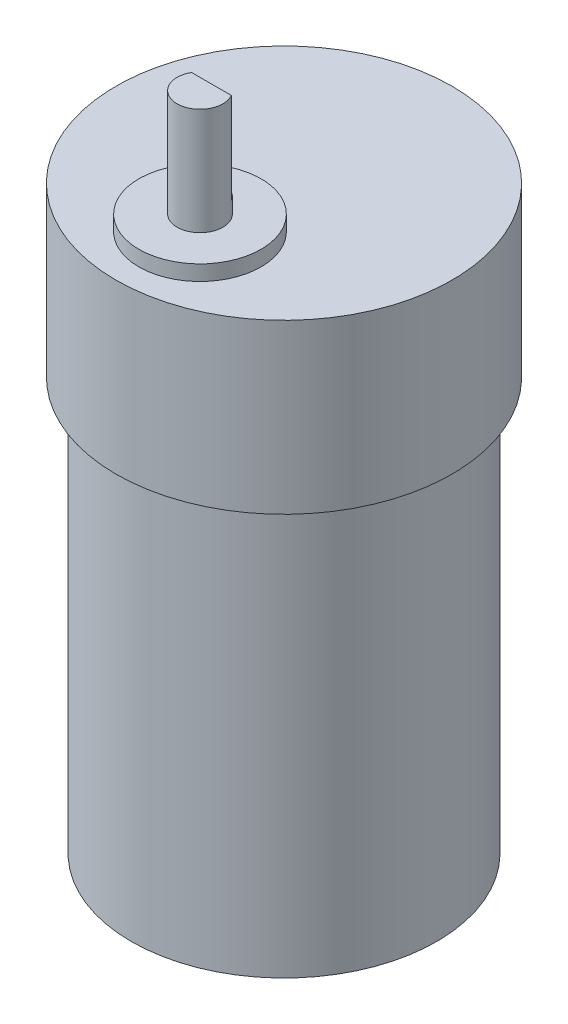
ISO-10303-21;
HEADER;
FILE_DESCRIPTION(('STEP AP214'),'2;1');
FILE_NAME('part.step','',(''),(''),'','','');
FILE_SCHEMA(('AUTOMOTIVE_DESIGN { 1 0 10303 214 1 1 1 1 }'));
ENDSEC;
DATA;
#1=APPLICATION_CONTEXT('core data for automotive mechanical design processes');
#2=APPLICATION_PROTOCOL_DEFINITION('international standard','automotive_design',2000,#1);
#3=PRODUCT_CONTEXT('',#1,'mechanical');
#4=PRODUCT('Part','Part','',(#3));
#5=PRODUCT_RELATED_PRODUCT_CATEGORY('part','',(#4));
#6=PRODUCT_DEFINITION_FORMATION('','',#4);
#7=PRODUCT_DEFINITION_CONTEXT('part definition',#1,'design');
#8=PRODUCT_DEFINITION('design','',#6,#7);
#9=PRODUCT_DEFINITION_SHAPE('','',#8);
#10=(LENGTH_UNIT() NAMED_UNIT(*) SI_UNIT(.MILLI.,.METRE.));
#11=(NAMED_UNIT(*) PLANE_ANGLE_UNIT() SI_UNIT($,.RADIAN.));
#12=(NAMED_UNIT(*) SI_UNIT($,.STERADIAN.) SOLID_ANGLE_UNIT());
#13=UNCERTAINTY_MEASURE_WITH_UNIT(LENGTH_MEASURE(1.E-05),#10,'distance_accuracy_value','');
#14=(GEOMETRIC_REPRESENTATION_CONTEXT(3) GLOBAL_UNCERTAINTY_ASSIGNED_CONTEXT((#13)) GLOBAL_UNIT_ASSIGNED_CONTEXT((#10,
#11,#12)) REPRESENTATION_CONTEXT('',''));
#15=CARTESIAN_POINT('',(0.,0.,0.));
#16=DIRECTION('',(0.,0.,1.));
#17=DIRECTION('',(1.,0.,0.));
#18=AXIS2_PLACEMENT_3D('',#15,#16,#17);
#19=CARTESIAN_POINT('',(0.,0.,0.));
#20=DIRECTION('',(0.,1.,0.));
#21=DIRECTION('',(0.,0.,1.));
#22=AXIS2_PLACEMENT_3D('',#19,#20,#21);
#23=PLANE('',#22);
#24=CARTESIAN_POINT('',(0.,0.,0.));
#25=DIRECTION('',(0.,1.,0.));
#26=DIRECTION('',(0.,0.,1.));
#27=AXIS2_PLACEMENT_3D('',#24,#25,#26);
#28=CIRCLE('',#27,15.875);
#29=CARTESIAN_POINT('',(0.,0.,15.875));
#30=VERTEX_POINT('',#29);
#31=EDGE_CURVE('E92',#30,#30,#28,.T.);
#32=ORIENTED_EDGE('',*,*,#31,.F.);
#33=EDGE_LOOP('',(#32));
#34=FACE_BOUND('',#33,.T.);
#35=CARTESIAN_POINT('',(0.,0.,0.));
#36=DIRECTION('',(0.,1.,0.));
#37=DIRECTION('',(0.,0.,1.));
#38=AXIS2_PLACEMENT_3D('',#35,#36,#37);
#39=CIRCLE('',#38,4.7625);
#40=CARTESIAN_POINT('',(0.,0.,4.7625));
#41=VERTEX_POINT('',#40);
#42=EDGE_CURVE('E11',#41,#41,#39,.F.);
#43=ORIENTED_EDGE('',*,*,#42,.F.);
#44=EDGE_LOOP('',(#43));
#45=FACE_BOUND('',#44,.T.);
#46=ADVANCED_FACE('F35',(#34,#45),#23,.F.);
#47=CARTESIAN_POINT('',(0.,61.9125,8.73252));
#48=DIRECTION('',(0.,1.,0.));
#49=DIRECTION('',(0.,0.,1.));
#50=AXIS2_PLACEMENT_3D('',#47,#48,#49);
#51=PLANE('',#50);
#52=CARTESIAN_POINT('',(0.,61.9125,8.73252));
#53=DIRECTION('',(0.,1.,0.));
#54=DIRECTION('',(0.,0.,1.));
#55=AXIS2_PLACEMENT_3D('',#52,#53,#54);
#56=CIRCLE('',#55,6.35);
#57=CARTESIAN_POINT('',(0.,61.9125,15.08252));
#58=VERTEX_POINT('',#57);
#59=EDGE_CURVE('E80',#58,#58,#56,.T.);
#60=ORIENTED_EDGE('',*,*,#59,.T.);
#61=EDGE_LOOP('',(#60));
#62=FACE_BOUND('',#61,.T.);
#63=CARTESIAN_POINT('',(0.,61.9125,8.73252));
#64=DIRECTION('',(0.,1.,0.));
#65=DIRECTION('',(0.,0.,1.));
#66=AXIS2_PLACEMENT_3D('',#63,#64,#65);
#67=CIRCLE('',#66,2.38125);
#68=CARTESIAN_POINT('',(0.,61.9125,11.11377));
#69=VERTEX_POINT('',#68);
#70=EDGE_CURVE('E74',#69,#69,#67,.T.);
#71=ORIENTED_EDGE('',*,*,#70,.F.);
#72=EDGE_LOOP('',(#71));
#73=FACE_BOUND('',#72,.T.);
#74=ADVANCED_FACE('F102',(#62,#73),#51,.T.);
#75=CARTESIAN_POINT('',(0.,60.325,0.));
#76=DIRECTION('',(0.,1.,0.));
#77=DIRECTION('',(0.,0.,1.));
#78=AXIS2_PLACEMENT_3D('',#75,#76,#77);
#79=PLANE('',#78);
#80=CARTESIAN_POINT('',(0.,60.325,0.));
#81=DIRECTION('',(0.,1.,0.));
#82=DIRECTION('',(0.,0.,1.));
#83=AXIS2_PLACEMENT_3D('',#80,#81,#82);
#84=CIRCLE('',#83,17.4625);
#85=CARTESIAN_POINT('',(0.,60.325,17.4625));
#86=VERTEX_POINT('',#85);
#87=EDGE_CURVE('E89',#86,#86,#84,.T.);
#88=ORIENTED_EDGE('',*,*,#87,.T.);
#89=EDGE_LOOP('',(#88));
#90=FACE_BOUND('',#89,.T.);
#91=CARTESIAN_POINT('',(0.,60.325,8.73252));
#92=DIRECTION('',(0.,1.,0.));
#93=DIRECTION('',(0.,0.,1.));
#94=AXIS2_PLACEMENT_3D('',#91,#92,#93);
#95=CIRCLE('',#94,6.35);
#96=CARTESIAN_POINT('',(0.,60.325,15.08252));
#97=VERTEX_POINT('',#96);
#98=EDGE_CURVE('E77',#97,#97,#95,.T.);
#99=ORIENTED_EDGE('',*,*,#98,.F.);
#100=EDGE_LOOP('',(#99));
#101=FACE_BOUND('',#100,.T.);
#102=ADVANCED_FACE('F130',(#90,#101),#79,.T.);
#103=CARTESIAN_POINT('',(0.,42.8625,0.));
#104=DIRECTION('',(0.,-1.,0.));
#105=DIRECTION('',(0.,0.,-1.));
#106=AXIS2_PLACEMENT_3D('',#103,#104,#105);
#107=CYLINDRICAL_SURFACE('',#106,15.875);
#108=CARTESIAN_POINT('',(0.,42.8625,0.));
#109=DIRECTION('',(0.,1.,0.));
#110=DIRECTION('',(0.,0.,1.));
#111=AXIS2_PLACEMENT_3D('',#108,#109,#110);
#112=CIRCLE('',#111,15.875);
#113=CARTESIAN_POINT('',(0.,42.8625,15.875));
#114=VERTEX_POINT('',#113);
#115=EDGE_CURVE('E43',#114,#114,#112,.T.);
#116=ORIENTED_EDGE('',*,*,#115,.F.);
#117=EDGE_LOOP('',(#116));
#118=FACE_BOUND('',#117,.T.);
#119=ORIENTED_EDGE('',*,*,#31,.T.);
#120=EDGE_LOOP('',(#119));
#121=FACE_BOUND('',#120,.T.);
#122=ADVANCED_FACE('F37',(#118,#121),#107,.T.);
#123=CARTESIAN_POINT('',(0.,42.8625,0.));
#124=DIRECTION('',(0.,1.,0.));
#125=DIRECTION('',(0.,0.,1.));
#126=AXIS2_PLACEMENT_3D('',#123,#124,#125);
#127=PLANE('',#126);
#128=CARTESIAN_POINT('',(0.,42.8625,0.));
#129=DIRECTION('',(0.,1.,0.));
#130=DIRECTION('',(0.,0.,1.));
#131=AXIS2_PLACEMENT_3D('',#128,#129,#130);
#132=CIRCLE('',#131,17.4625);
#133=CARTESIAN_POINT('',(0.,42.8625,17.4625));
#134=VERTEX_POINT('',#133);
#135=EDGE_CURVE('E87',#134,#134,#132,.T.);
#136=ORIENTED_EDGE('',*,*,#135,.F.);
#137=EDGE_LOOP('',(#136));
#138=FACE_BOUND('',#137,.T.);
#139=ORIENTED_EDGE('',*,*,#115,.T.);
#140=EDGE_LOOP('',(#139));
#141=FACE_BOUND('',#140,.T.);
#142=ADVANCED_FACE('F139',(#138,#141),#127,.F.);
#143=CARTESIAN_POINT('',(0.,60.325,0.));
#144=DIRECTION('',(0.,-1.,0.));
#145=DIRECTION('',(0.,0.,-1.));
#146=AXIS2_PLACEMENT_3D('',#143,#144,#145);
#147=CYLINDRICAL_SURFACE('',#146,17.4625);
#148=ORIENTED_EDGE('',*,*,#87,.F.);
#149=EDGE_LOOP('',(#148));
#150=FACE_BOUND('',#149,.T.);
#151=ORIENTED_EDGE('',*,*,#135,.T.);
#152=EDGE_LOOP('',(#151));
#153=FACE_BOUND('',#152,.T.);
#154=ADVANCED_FACE('F134',(#150,#153),#147,.T.);
#155=CARTESIAN_POINT('',(0.,61.9125,8.73252));
#156=DIRECTION('',(0.,-1.,0.));
#157=DIRECTION('',(0.,0.,-1.));
#158=AXIS2_PLACEMENT_3D('',#155,#156,#157);
#159=CYLINDRICAL_SURFACE('',#158,6.35);
#160=ORIENTED_EDGE('',*,*,#59,.F.);
#161=EDGE_LOOP('',(#160));
#162=FACE_BOUND('',#161,.T.);
#163=ORIENTED_EDGE('',*,*,#98,.T.);
#164=EDGE_LOOP('',(#163));
#165=FACE_BOUND('',#164,.T.);
#166=ADVANCED_FACE('F127',(#162,#165),#159,.T.);
#167=CARTESIAN_POINT('',(0.,73.025,8.73252));
#168=DIRECTION('',(0.,-1.,0.));
#169=DIRECTION('',(0.,0.,-1.));
#170=AXIS2_PLACEMENT_3D('',#167,#168,#169);
#171=CYLINDRICAL_SURFACE('',#170,2.38125);
#172=CARTESIAN_POINT('',(0.,73.025,8.73252));
#173=DIRECTION('',(0.,1.,0.));
#174=DIRECTION('',(0.,0.,1.));
#175=AXIS2_PLACEMENT_3D('',#172,#173,#174);
#176=CIRCLE('',#175,2.38125);
#177=CARTESIAN_POINT('',(-2.06222299276169,73.025,7.541895));
#178=VERTEX_POINT('',#177);
#179=CARTESIAN_POINT('',(2.06222299276169,73.025,7.541895));
#180=VERTEX_POINT('',#179);
#181=EDGE_CURVE('E73',#178,#180,#176,.T.);
#182=ORIENTED_EDGE('',*,*,#181,.F.);
#183=DIRECTION('',(0.,1.,0.));
#184=VECTOR('',#183,1.);
#185=CARTESIAN_POINT('',(-2.06222299276169,63.5,7.541895));
#186=LINE('',#185,#184);
#187=CARTESIAN_POINT('',(-2.06222299276169,63.5,7.541895));
#188=VERTEX_POINT('',#187);
#189=EDGE_CURVE('E50',#188,#178,#186,.T.);
#190=ORIENTED_EDGE('',*,*,#189,.F.);
#191=CARTESIAN_POINT('',(0.,63.5,8.73252));
#192=DIRECTION('',(0.,1.,0.));
#193=DIRECTION('',(0.,0.,1.));
#194=AXIS2_PLACEMENT_3D('',#191,#192,#193);
#195=CIRCLE('',#194,2.38125);
#196=CARTESIAN_POINT('',(2.06222299276169,63.5,7.541895));
#197=VERTEX_POINT('',#196);
#198=EDGE_CURVE('E66',#197,#188,#195,.T.);
#199=ORIENTED_EDGE('',*,*,#198,.F.);
#200=DIRECTION('',(0.,1.,0.));
#201=VECTOR('',#200,1.);
#202=CARTESIAN_POINT('',(2.06222299276169,63.5,7.541895));
#203=LINE('',#202,#201);
#204=EDGE_CURVE('E56',#197,#180,#203,.T.);
#205=ORIENTED_EDGE('',*,*,#204,.T.);
#206=EDGE_LOOP('',(#182,#190,#199,#205));
#207=FACE_BOUND('',#206,.T.);
#208=ORIENTED_EDGE('',*,*,#70,.T.);
#209=EDGE_LOOP('',(#208));
#210=FACE_BOUND('',#209,.T.);
#211=ADVANCED_FACE('F71',(#207,#210),#171,.T.);
#212=CARTESIAN_POINT('',(0.,73.025,8.73252));
#213=DIRECTION('',(0.,1.,0.));
#214=DIRECTION('',(0.,0.,1.));
#215=AXIS2_PLACEMENT_3D('',#212,#213,#214);
#216=PLANE('',#215);
#217=DIRECTION('',(1.,0.,0.));
#218=VECTOR('',#217,1.);
#219=CARTESIAN_POINT('',(-2.06222299276169,73.025,7.541895));
#220=LINE('',#219,#218);
#221=EDGE_CURVE('E61',#178,#180,#220,.T.);
#222=ORIENTED_EDGE('',*,*,#221,.F.);
#223=ORIENTED_EDGE('',*,*,#181,.T.);
#224=EDGE_LOOP('',(#222,#223));
#225=FACE_BOUND('',#224,.T.);
#226=ADVANCED_FACE('F76',(#225),#216,.T.);
#227=CARTESIAN_POINT('',(-2.06222299276169,63.5,7.541895));
#228=DIRECTION('',(0.,0.,1.));
#229=DIRECTION('',(1.,0.,0.));
#230=AXIS2_PLACEMENT_3D('',#227,#228,#229);
#231=PLANE('',#230);
#232=ORIENTED_EDGE('',*,*,#221,.T.);
#233=ORIENTED_EDGE('',*,*,#204,.F.);
#234=DIRECTION('',(1.,0.,0.));
#235=VECTOR('',#234,1.);
#236=CARTESIAN_POINT('',(-2.06222299276169,63.5,7.541895));
#237=LINE('',#236,#235);
#238=EDGE_CURVE('E238',#188,#197,#237,.T.);
#239=ORIENTED_EDGE('',*,*,#238,.F.);
#240=ORIENTED_EDGE('',*,*,#189,.T.);
#241=EDGE_LOOP('',(#232,#233,#239,#240));
#242=FACE_BOUND('',#241,.T.);
#243=ADVANCED_FACE('F62',(#242),#231,.F.);
#244=CARTESIAN_POINT('',(0.,63.5,8.73252));
#245=DIRECTION('',(0.,1.,0.));
#246=DIRECTION('',(0.,0.,1.));
#247=AXIS2_PLACEMENT_3D('',#244,#245,#246);
#248=PLANE('',#247);
#249=ORIENTED_EDGE('',*,*,#198,.T.);
#250=ORIENTED_EDGE('',*,*,#238,.T.);
#251=EDGE_LOOP('',(#249,#250));
#252=FACE_BOUND('',#251,.T.);
#253=ADVANCED_FACE('F108',(#252),#248,.T.);
#254=CARTESIAN_POINT('',(0.,-1.5875,0.));
#255=DIRECTION('',(0.,1.,0.));
#256=DIRECTION('',(0.,0.,1.));
#257=AXIS2_PLACEMENT_3D('',#254,#255,#256);
#258=CYLINDRICAL_SURFACE('',#257,4.7625);
#259=CARTESIAN_POINT('',(0.,-1.5875,0.));
#260=DIRECTION('',(0.,-1.,0.));
#261=DIRECTION('',(0.,0.,-1.));
#262=AXIS2_PLACEMENT_3D('',#259,#260,#261);
#263=CIRCLE('',#262,4.7625);
#264=CARTESIAN_POINT('',(0.,-1.5875,-4.7625));
#265=VERTEX_POINT('',#264);
#266=EDGE_CURVE('E67',#265,#265,#263,.T.);
#267=ORIENTED_EDGE('',*,*,#266,.F.);
#268=EDGE_LOOP('',(#267));
#269=FACE_BOUND('',#268,.T.);
#270=ORIENTED_EDGE('',*,*,#42,.T.);
#271=EDGE_LOOP('',(#270));
#272=FACE_BOUND('',#271,.T.);
#273=ADVANCED_FACE('F105',(#269,#272),#258,.T.);
#274=CARTESIAN_POINT('',(0.,-1.5875,0.));
#275=DIRECTION('',(0.,-1.,0.));
#276=DIRECTION('',(0.,0.,-1.));
#277=AXIS2_PLACEMENT_3D('',#274,#275,#276);
#278=PLANE('',#277);
#279=ORIENTED_EDGE('',*,*,#266,.T.);
#280=EDGE_LOOP('',(#279));
#281=FACE_BOUND('',#280,.T.);
#282=ADVANCED_FACE('F107',(#281),#278,.T.);
#283=CLOSED_SHELL('',(#46,#74,#102,#122,#142,#154,#166,#211,#226,#243,#253,#273,#282));
#284=MANIFOLD_SOLID_BREP('B2',#283);
#285=ADVANCED_BREP_SHAPE_REPRESENTATION('',(#18,#284),#14);
#286=SHAPE_DEFINITION_REPRESENTATION(#9,#285);
ENDSEC;
END-ISO-10303-21;
